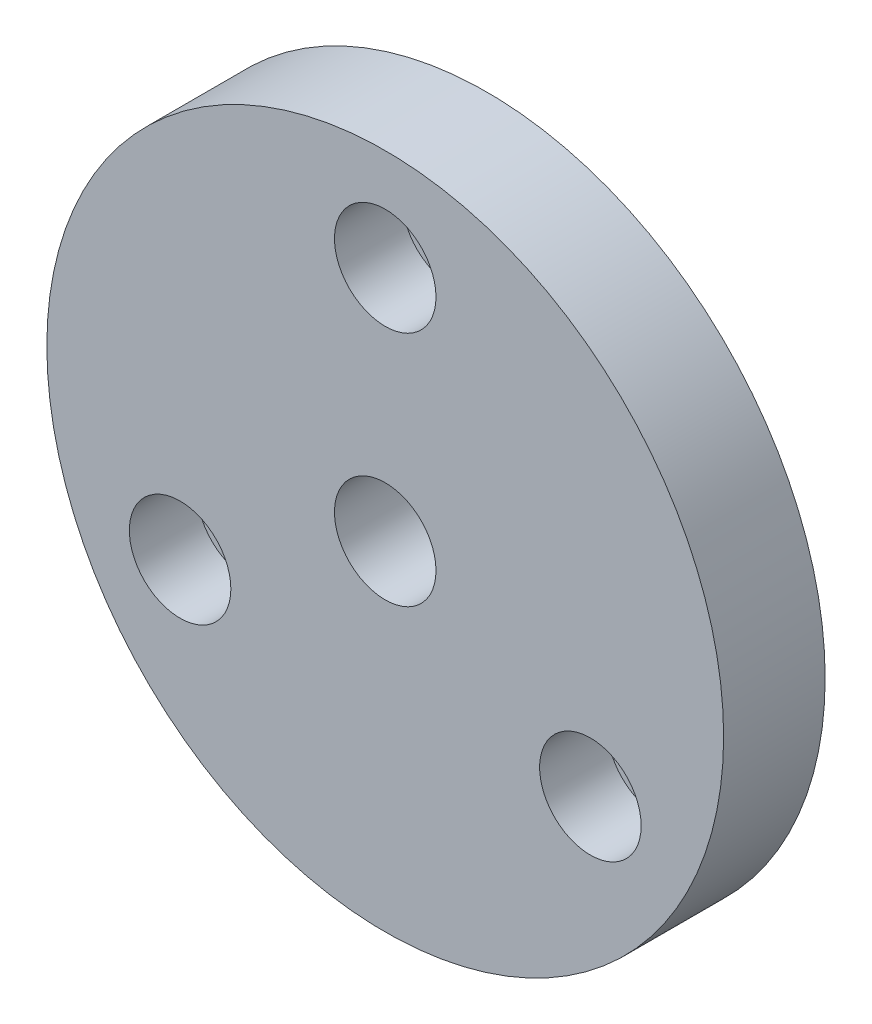
ISO-10303-21;
HEADER;
FILE_DESCRIPTION(('STEP AP214'),'2;1');
FILE_NAME('part.step','',(''),(''),'','','');
FILE_SCHEMA(('AUTOMOTIVE_DESIGN { 1 0 10303 214 1 1 1 1 }'));
ENDSEC;
DATA;
#1=APPLICATION_CONTEXT('core data for automotive mechanical design processes');
#2=APPLICATION_PROTOCOL_DEFINITION('international standard','automotive_design',2000,#1);
#3=PRODUCT_CONTEXT('',#1,'mechanical');
#4=PRODUCT('Part','Part','',(#3));
#5=PRODUCT_RELATED_PRODUCT_CATEGORY('part','',(#4));
#6=PRODUCT_DEFINITION_FORMATION('','',#4);
#7=PRODUCT_DEFINITION_CONTEXT('part definition',#1,'design');
#8=PRODUCT_DEFINITION('design','',#6,#7);
#9=PRODUCT_DEFINITION_SHAPE('','',#8);
#10=(LENGTH_UNIT() NAMED_UNIT(*) SI_UNIT(.MILLI.,.METRE.));
#11=(NAMED_UNIT(*) PLANE_ANGLE_UNIT() SI_UNIT($,.RADIAN.));
#12=(NAMED_UNIT(*) SI_UNIT($,.STERADIAN.) SOLID_ANGLE_UNIT());
#13=UNCERTAINTY_MEASURE_WITH_UNIT(LENGTH_MEASURE(1.E-05),#10,'distance_accuracy_value','');
#14=(GEOMETRIC_REPRESENTATION_CONTEXT(3) GLOBAL_UNCERTAINTY_ASSIGNED_CONTEXT((#13)) GLOBAL_UNIT_ASSIGNED_CONTEXT((#10,
#11,#12)) REPRESENTATION_CONTEXT('',''));
#15=CARTESIAN_POINT('',(0.,0.,0.));
#16=DIRECTION('',(0.,0.,1.));
#17=DIRECTION('',(1.,0.,0.));
#18=AXIS2_PLACEMENT_3D('',#15,#16,#17);
#19=CARTESIAN_POINT('',(0.,0.,6.));
#20=DIRECTION('',(0.,0.,1.));
#21=DIRECTION('',(1.,0.,0.));
#22=AXIS2_PLACEMENT_3D('',#19,#20,#21);
#23=PLANE('',#22);
#24=CARTESIAN_POINT('',(-12.1243556529819,-7.00000000000014,6.));
#25=DIRECTION('',(0.,0.,1.));
#26=DIRECTION('',(1.,0.,0.));
#27=AXIS2_PLACEMENT_3D('',#24,#25,#26);
#28=CIRCLE('',#27,3.00000000000039);
#29=CARTESIAN_POINT('',(-9.1243556529815,-7.00000000000014,6.));
#30=VERTEX_POINT('',#29);
#31=EDGE_CURVE('E64',#30,#30,#28,.T.);
#32=ORIENTED_EDGE('',*,*,#31,.F.);
#33=EDGE_LOOP('',(#32));
#34=FACE_BOUND('',#33,.T.);
#35=CARTESIAN_POINT('',(12.1243556529824,-6.99999999999985,6.));
#36=DIRECTION('',(0.,0.,1.));
#37=DIRECTION('',(1.,0.,0.));
#38=AXIS2_PLACEMENT_3D('',#35,#36,#37);
#39=CIRCLE('',#38,3.00000000000025);
#40=CARTESIAN_POINT('',(15.1243556529826,-6.99999999999985,6.));
#41=VERTEX_POINT('',#40);
#42=EDGE_CURVE('E58',#41,#41,#39,.T.);
#43=ORIENTED_EDGE('',*,*,#42,.F.);
#44=EDGE_LOOP('',(#43));
#45=FACE_BOUND('',#44,.T.);
#46=CARTESIAN_POINT('',(0.,14.,6.));
#47=DIRECTION('',(0.,0.,1.));
#48=DIRECTION('',(1.,0.,0.));
#49=AXIS2_PLACEMENT_3D('',#46,#47,#48);
#50=CIRCLE('',#49,3.);
#51=CARTESIAN_POINT('',(3.,14.,6.));
#52=VERTEX_POINT('',#51);
#53=EDGE_CURVE('E52',#52,#52,#50,.T.);
#54=ORIENTED_EDGE('',*,*,#53,.F.);
#55=EDGE_LOOP('',(#54));
#56=FACE_BOUND('',#55,.T.);
#57=CARTESIAN_POINT('',(0.,0.,6.));
#58=DIRECTION('',(0.,0.,1.));
#59=DIRECTION('',(1.,0.,0.));
#60=AXIS2_PLACEMENT_3D('',#57,#58,#59);
#61=CIRCLE('',#60,20.);
#62=CARTESIAN_POINT('',(20.,0.,6.));
#63=VERTEX_POINT('',#62);
#64=EDGE_CURVE('E10',#63,#63,#61,.T.);
#65=ORIENTED_EDGE('',*,*,#64,.T.);
#66=EDGE_LOOP('',(#65));
#67=FACE_BOUND('',#66,.T.);
#68=CARTESIAN_POINT('',(0.,0.,6.));
#69=DIRECTION('',(0.,0.,1.));
#70=DIRECTION('',(1.,0.,0.));
#71=AXIS2_PLACEMENT_3D('',#68,#69,#70);
#72=CIRCLE('',#71,3.);
#73=CARTESIAN_POINT('',(3.,0.,6.));
#74=VERTEX_POINT('',#73);
#75=EDGE_CURVE('E40',#74,#74,#72,.T.);
#76=ORIENTED_EDGE('',*,*,#75,.F.);
#77=EDGE_LOOP('',(#76));
#78=FACE_BOUND('',#77,.T.);
#79=ADVANCED_FACE('F29',(#34,#45,#56,#67,#78),#23,.T.);
#80=CARTESIAN_POINT('',(0.,0.,0.));
#81=DIRECTION('',(0.,0.,1.));
#82=DIRECTION('',(1.,0.,0.));
#83=AXIS2_PLACEMENT_3D('',#80,#81,#82);
#84=PLANE('',#83);
#85=CARTESIAN_POINT('',(0.,0.,0.));
#86=DIRECTION('',(0.,0.,1.));
#87=DIRECTION('',(1.,0.,0.));
#88=AXIS2_PLACEMENT_3D('',#85,#86,#87);
#89=CIRCLE('',#88,20.);
#90=CARTESIAN_POINT('',(20.,0.,0.));
#91=VERTEX_POINT('',#90);
#92=EDGE_CURVE('E36',#91,#91,#89,.T.);
#93=ORIENTED_EDGE('',*,*,#92,.F.);
#94=EDGE_LOOP('',(#93));
#95=FACE_BOUND('',#94,.T.);
#96=CARTESIAN_POINT('',(0.,0.,0.));
#97=DIRECTION('',(0.,0.,1.));
#98=DIRECTION('',(1.,0.,0.));
#99=AXIS2_PLACEMENT_3D('',#96,#97,#98);
#100=CIRCLE('',#99,3.);
#101=CARTESIAN_POINT('',(3.,0.,0.));
#102=VERTEX_POINT('',#101);
#103=EDGE_CURVE('E44',#102,#102,#100,.T.);
#104=ORIENTED_EDGE('',*,*,#103,.T.);
#105=EDGE_LOOP('',(#104));
#106=FACE_BOUND('',#105,.T.);
#107=ADVANCED_FACE('F72',(#95,#106),#84,.F.);
#108=CARTESIAN_POINT('',(0.,0.,6.));
#109=DIRECTION('',(0.,0.,-1.));
#110=DIRECTION('',(-1.,0.,0.));
#111=AXIS2_PLACEMENT_3D('',#108,#109,#110);
#112=CYLINDRICAL_SURFACE('',#111,20.);
#113=ORIENTED_EDGE('',*,*,#64,.F.);
#114=EDGE_LOOP('',(#113));
#115=FACE_BOUND('',#114,.T.);
#116=ORIENTED_EDGE('',*,*,#92,.T.);
#117=EDGE_LOOP('',(#116));
#118=FACE_BOUND('',#117,.T.);
#119=ADVANCED_FACE('F31',(#115,#118),#112,.T.);
#120=CARTESIAN_POINT('',(0.,0.,6.));
#121=DIRECTION('',(0.,0.,-1.));
#122=DIRECTION('',(-1.,0.,0.));
#123=AXIS2_PLACEMENT_3D('',#120,#121,#122);
#124=CYLINDRICAL_SURFACE('',#123,3.);
#125=ORIENTED_EDGE('',*,*,#75,.T.);
#126=EDGE_LOOP('',(#125));
#127=FACE_BOUND('',#126,.T.);
#128=ORIENTED_EDGE('',*,*,#103,.F.);
#129=EDGE_LOOP('',(#128));
#130=FACE_BOUND('',#129,.T.);
#131=ADVANCED_FACE('F79',(#127,#130),#124,.F.);
#132=CARTESIAN_POINT('',(0.,14.,2.));
#133=DIRECTION('',(0.,0.,1.));
#134=DIRECTION('',(1.,0.,0.));
#135=AXIS2_PLACEMENT_3D('',#132,#133,#134);
#136=CYLINDRICAL_SURFACE('',#135,3.);
#137=CARTESIAN_POINT('',(0.,14.,2.));
#138=DIRECTION('',(0.,0.,1.));
#139=DIRECTION('',(1.,0.,0.));
#140=AXIS2_PLACEMENT_3D('',#137,#138,#139);
#141=CIRCLE('',#140,3.);
#142=CARTESIAN_POINT('',(3.,14.,2.));
#143=VERTEX_POINT('',#142);
#144=EDGE_CURVE('E49',#143,#143,#141,.T.);
#145=ORIENTED_EDGE('',*,*,#144,.F.);
#146=EDGE_LOOP('',(#145));
#147=FACE_BOUND('',#146,.T.);
#148=ORIENTED_EDGE('',*,*,#53,.T.);
#149=EDGE_LOOP('',(#148));
#150=FACE_BOUND('',#149,.T.);
#151=ADVANCED_FACE('F82',(#147,#150),#136,.F.);
#152=CARTESIAN_POINT('',(0.,14.,2.));
#153=DIRECTION('',(0.,0.,1.));
#154=DIRECTION('',(1.,0.,0.));
#155=AXIS2_PLACEMENT_3D('',#152,#153,#154);
#156=PLANE('',#155);
#157=ORIENTED_EDGE('',*,*,#144,.T.);
#158=EDGE_LOOP('',(#157));
#159=FACE_BOUND('',#158,.T.);
#160=ADVANCED_FACE('F96',(#159),#156,.T.);
#161=CARTESIAN_POINT('',(12.1243556529824,-6.99999999999985,2.));
#162=DIRECTION('',(0.,0.,1.));
#163=DIRECTION('',(1.,0.,0.));
#164=AXIS2_PLACEMENT_3D('',#161,#162,#163);
#165=CYLINDRICAL_SURFACE('',#164,3.00000000000025);
#166=CARTESIAN_POINT('',(12.1243556529824,-6.99999999999985,2.));
#167=DIRECTION('',(0.,0.,1.));
#168=DIRECTION('',(1.,0.,0.));
#169=AXIS2_PLACEMENT_3D('',#166,#167,#168);
#170=CIRCLE('',#169,3.00000000000025);
#171=CARTESIAN_POINT('',(15.1243556529826,-6.99999999999985,2.));
#172=VERTEX_POINT('',#171);
#173=EDGE_CURVE('E55',#172,#172,#170,.T.);
#174=ORIENTED_EDGE('',*,*,#173,.F.);
#175=EDGE_LOOP('',(#174));
#176=FACE_BOUND('',#175,.T.);
#177=ORIENTED_EDGE('',*,*,#42,.T.);
#178=EDGE_LOOP('',(#177));
#179=FACE_BOUND('',#178,.T.);
#180=ADVANCED_FACE('F100',(#176,#179),#165,.F.);
#181=CARTESIAN_POINT('',(12.1243556529824,-6.99999999999985,2.));
#182=DIRECTION('',(0.,0.,1.));
#183=DIRECTION('',(1.,0.,0.));
#184=AXIS2_PLACEMENT_3D('',#181,#182,#183);
#185=PLANE('',#184);
#186=ORIENTED_EDGE('',*,*,#173,.T.);
#187=EDGE_LOOP('',(#186));
#188=FACE_BOUND('',#187,.T.);
#189=ADVANCED_FACE('F104',(#188),#185,.T.);
#190=CARTESIAN_POINT('',(-12.1243556529819,-7.00000000000014,2.));
#191=DIRECTION('',(0.,0.,1.));
#192=DIRECTION('',(1.,0.,0.));
#193=AXIS2_PLACEMENT_3D('',#190,#191,#192);
#194=CYLINDRICAL_SURFACE('',#193,3.00000000000039);
#195=CARTESIAN_POINT('',(-12.1243556529819,-7.00000000000014,2.));
#196=DIRECTION('',(0.,0.,1.));
#197=DIRECTION('',(1.,0.,0.));
#198=AXIS2_PLACEMENT_3D('',#195,#196,#197);
#199=CIRCLE('',#198,3.00000000000039);
#200=CARTESIAN_POINT('',(-9.1243556529815,-7.00000000000014,2.));
#201=VERTEX_POINT('',#200);
#202=EDGE_CURVE('E61',#201,#201,#199,.T.);
#203=ORIENTED_EDGE('',*,*,#202,.F.);
#204=EDGE_LOOP('',(#203));
#205=FACE_BOUND('',#204,.T.);
#206=ORIENTED_EDGE('',*,*,#31,.T.);
#207=EDGE_LOOP('',(#206));
#208=FACE_BOUND('',#207,.T.);
#209=ADVANCED_FACE('F68',(#205,#208),#194,.F.);
#210=CARTESIAN_POINT('',(-12.1243556529819,-7.00000000000014,2.));
#211=DIRECTION('',(0.,0.,1.));
#212=DIRECTION('',(1.,0.,0.));
#213=AXIS2_PLACEMENT_3D('',#210,#211,#212);
#214=PLANE('',#213);
#215=ORIENTED_EDGE('',*,*,#202,.T.);
#216=EDGE_LOOP('',(#215));
#217=FACE_BOUND('',#216,.T.);
#218=ADVANCED_FACE('F111',(#217),#214,.T.);
#219=CLOSED_SHELL('',(#79,#107,#119,#131,#151,#160,#180,#189,#209,#218));
#220=MANIFOLD_SOLID_BREP('B2',#219);
#221=ADVANCED_BREP_SHAPE_REPRESENTATION('',(#18,#220),#14);
#222=SHAPE_DEFINITION_REPRESENTATION(#9,#221);
ENDSEC;
END-ISO-10303-21;
